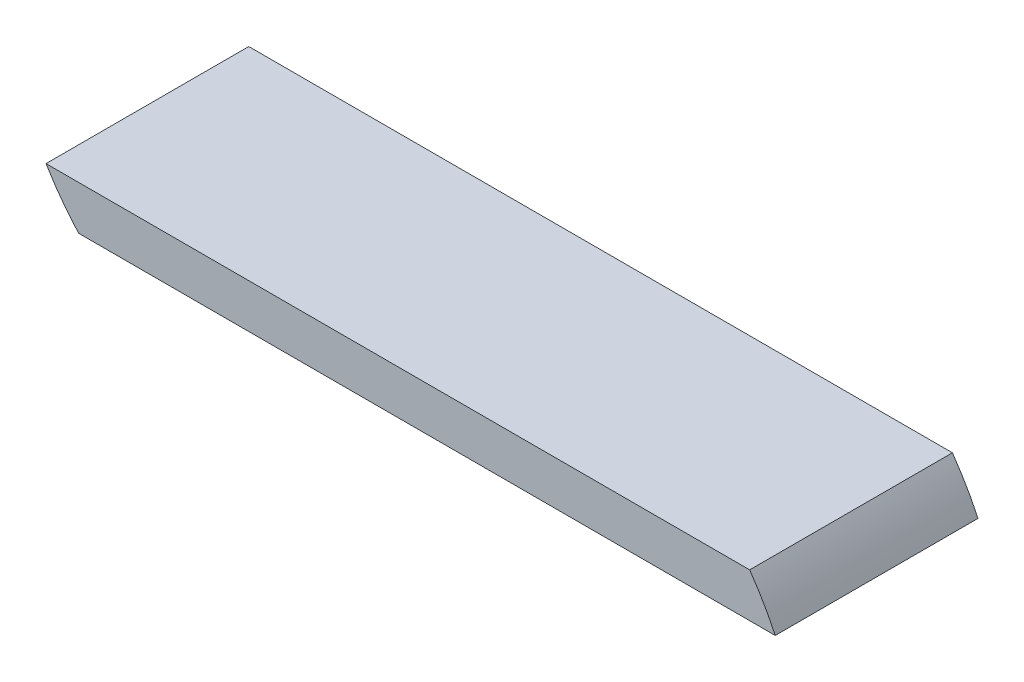
ISO-10303-21;
HEADER;
FILE_DESCRIPTION(('STEP AP214'),'2;1');
FILE_NAME('part.step','',(''),(''),'','','');
FILE_SCHEMA(('AUTOMOTIVE_DESIGN { 1 0 10303 214 1 1 1 1 }'));
ENDSEC;
DATA;
#1=APPLICATION_CONTEXT('core data for automotive mechanical design processes');
#2=APPLICATION_PROTOCOL_DEFINITION('international standard','automotive_design',2000,#1);
#3=PRODUCT_CONTEXT('',#1,'mechanical');
#4=PRODUCT('Part','Part','',(#3));
#5=PRODUCT_RELATED_PRODUCT_CATEGORY('part','',(#4));
#6=PRODUCT_DEFINITION_FORMATION('','',#4);
#7=PRODUCT_DEFINITION_CONTEXT('part definition',#1,'design');
#8=PRODUCT_DEFINITION('design','',#6,#7);
#9=PRODUCT_DEFINITION_SHAPE('','',#8);
#10=(LENGTH_UNIT() NAMED_UNIT(*) SI_UNIT(.MILLI.,.METRE.));
#11=(NAMED_UNIT(*) PLANE_ANGLE_UNIT() SI_UNIT($,.RADIAN.));
#12=(NAMED_UNIT(*) SI_UNIT($,.STERADIAN.) SOLID_ANGLE_UNIT());
#13=UNCERTAINTY_MEASURE_WITH_UNIT(LENGTH_MEASURE(1.E-05),#10,'distance_accuracy_value','');
#14=(GEOMETRIC_REPRESENTATION_CONTEXT(3) GLOBAL_UNCERTAINTY_ASSIGNED_CONTEXT((#13)) GLOBAL_UNIT_ASSIGNED_CONTEXT((#10,
#11,#12)) REPRESENTATION_CONTEXT('',''));
#15=CARTESIAN_POINT('',(0.,0.,0.));
#16=DIRECTION('',(0.,0.,1.));
#17=DIRECTION('',(1.,0.,0.));
#18=AXIS2_PLACEMENT_3D('',#15,#16,#17);
#19=CARTESIAN_POINT('',(-27.087440379805,6.071476226117,0.));
#20=DIRECTION('',(0.,-1.,0.));
#21=DIRECTION('',(1.,0.,0.));
#22=AXIS2_PLACEMENT_3D('',#19,#20,#21);
#23=PLANE('',#22);
#24=DIRECTION('',(1.,0.,0.));
#25=VECTOR('',#24,1.);
#26=CARTESIAN_POINT('',(-27.087440379805,6.071476226117,0.));
#27=LINE('',#26,#25);
#28=CARTESIAN_POINT('',(-27.087440379805,6.071476226117,0.));
#29=VERTEX_POINT('',#28);
#30=CARTESIAN_POINT('',(-26.743838043044,6.071476226117,0.));
#31=VERTEX_POINT('',#30);
#32=EDGE_CURVE('E11',#29,#31,#27,.T.);
#33=ORIENTED_EDGE('',*,*,#32,.T.);
#34=DIRECTION('',(0.,0.,1.));
#35=VECTOR('',#34,1.);
#36=CARTESIAN_POINT('',(-26.743838043044,6.071476226117,0.));
#37=LINE('',#36,#35);
#38=CARTESIAN_POINT('',(-26.743838043044,6.071476226117,0.1));
#39=VERTEX_POINT('',#38);
#40=EDGE_CURVE('E24',#31,#39,#37,.T.);
#41=ORIENTED_EDGE('',*,*,#40,.T.);
#42=DIRECTION('',(1.,0.,0.));
#43=VECTOR('',#42,1.);
#44=CARTESIAN_POINT('',(-27.087440379805,6.071476226117,0.1));
#45=LINE('',#44,#43);
#46=CARTESIAN_POINT('',(-27.087440379805,6.071476226117,0.1));
#47=VERTEX_POINT('',#46);
#48=EDGE_CURVE('E75',#47,#39,#45,.T.);
#49=ORIENTED_EDGE('',*,*,#48,.F.);
#50=DIRECTION('',(0.,0.,1.));
#51=VECTOR('',#50,1.);
#52=CARTESIAN_POINT('',(-27.087440379805,6.071476226117,0.));
#53=LINE('',#52,#51);
#54=EDGE_CURVE('E86',#29,#47,#53,.T.);
#55=ORIENTED_EDGE('',*,*,#54,.F.);
#56=EDGE_LOOP('',(#33,#41,#49,#55));
#57=FACE_BOUND('',#56,.T.);
#58=ADVANCED_FACE('F17',(#57),#23,.T.);
#59=CARTESIAN_POINT('',(-26.983342085285,6.165251438178,0.));
#60=DIRECTION('',(0.,0.,1.));
#61=DIRECTION('',(-0.857659383589662,-0.514218223851121,0.));
#62=AXIS2_PLACEMENT_3D('',#59,#60,#61);
#63=CYLINDRICAL_SURFACE('',#62,0.140107977356891);
#64=CARTESIAN_POINT('',(-26.983342085285,6.165251438178,0.));
#65=DIRECTION('',(0.,0.,1.));
#66=DIRECTION('',(-0.857659383589662,-0.514218223851121,0.));
#67=AXIS2_PLACEMENT_3D('',#64,#65,#66);
#68=CIRCLE('',#67,0.140107977356891);
#69=CARTESIAN_POINT('',(-27.103507006781,6.093205362914,0.));
#70=VERTEX_POINT('',#69);
#71=EDGE_CURVE('E83',#70,#29,#68,.T.);
#72=ORIENTED_EDGE('',*,*,#71,.T.);
#73=ORIENTED_EDGE('',*,*,#54,.T.);
#74=CARTESIAN_POINT('',(-26.983342085285,6.165251438178,0.1));
#75=DIRECTION('',(0.,0.,1.));
#76=DIRECTION('',(-0.857659383589662,-0.514218223851121,0.));
#77=AXIS2_PLACEMENT_3D('',#74,#75,#76);
#78=CIRCLE('',#77,0.140107977356891);
#79=CARTESIAN_POINT('',(-27.103507006781,6.093205362914,0.1));
#80=VERTEX_POINT('',#79);
#81=EDGE_CURVE('E81',#80,#47,#78,.T.);
#82=ORIENTED_EDGE('',*,*,#81,.F.);
#83=DIRECTION('',(0.,0.,1.));
#84=VECTOR('',#83,1.);
#85=CARTESIAN_POINT('',(-27.103507006781,6.093205362914,0.));
#86=LINE('',#85,#84);
#87=EDGE_CURVE('E61',#70,#80,#86,.T.);
#88=ORIENTED_EDGE('',*,*,#87,.F.);
#89=EDGE_LOOP('',(#72,#73,#82,#88));
#90=FACE_BOUND('',#89,.T.);
#91=ADVANCED_FACE('F91',(#90),#63,.T.);
#92=CARTESIAN_POINT('',(-26.756454263164,6.093205362914,0.));
#93=DIRECTION('',(0.,1.,0.));
#94=DIRECTION('',(-1.,0.,0.));
#95=AXIS2_PLACEMENT_3D('',#92,#93,#94);
#96=PLANE('',#95);
#97=DIRECTION('',(-1.,0.,0.));
#98=VECTOR('',#97,1.);
#99=CARTESIAN_POINT('',(-26.756454263164,6.093205362914,0.));
#100=LINE('',#99,#98);
#101=CARTESIAN_POINT('',(-26.756454263164,6.093205362914,0.));
#102=VERTEX_POINT('',#101);
#103=EDGE_CURVE('E65',#102,#70,#100,.T.);
#104=ORIENTED_EDGE('',*,*,#103,.T.);
#105=ORIENTED_EDGE('',*,*,#87,.T.);
#106=DIRECTION('',(-1.,0.,0.));
#107=VECTOR('',#106,1.);
#108=CARTESIAN_POINT('',(-26.756454263164,6.093205362914,0.1));
#109=LINE('',#108,#107);
#110=CARTESIAN_POINT('',(-26.756454263164,6.093205362914,0.1));
#111=VERTEX_POINT('',#110);
#112=EDGE_CURVE('E54',#111,#80,#109,.T.);
#113=ORIENTED_EDGE('',*,*,#112,.F.);
#114=DIRECTION('',(0.,0.,1.));
#115=VECTOR('',#114,1.);
#116=CARTESIAN_POINT('',(-26.756454263164,6.093205362914,0.));
#117=LINE('',#116,#115);
#118=EDGE_CURVE('E58',#102,#111,#117,.T.);
#119=ORIENTED_EDGE('',*,*,#118,.F.);
#120=EDGE_LOOP('',(#104,#105,#113,#119));
#121=FACE_BOUND('',#120,.T.);
#122=ADVANCED_FACE('F57',(#121),#96,.T.);
#123=CARTESIAN_POINT('',(-26.871812170946,6.011699918327,0.));
#124=DIRECTION('',(0.,0.,1.));
#125=DIRECTION('',(0.906033734151552,0.42320547323894,0.));
#126=AXIS2_PLACEMENT_3D('',#123,#124,#125);
#127=CYLINDRICAL_SURFACE('',#126,0.141246537604029);
#128=CARTESIAN_POINT('',(-26.871812170946,6.011699918327,0.));
#129=DIRECTION('',(0.,0.,1.));
#130=DIRECTION('',(0.906033734151552,0.42320547323894,0.));
#131=AXIS2_PLACEMENT_3D('',#128,#129,#130);
#132=CIRCLE('',#131,0.141246537604029);
#133=EDGE_CURVE('E71',#31,#102,#132,.T.);
#134=ORIENTED_EDGE('',*,*,#133,.T.);
#135=ORIENTED_EDGE('',*,*,#118,.T.);
#136=CARTESIAN_POINT('',(-26.871812170946,6.011699918327,0.1));
#137=DIRECTION('',(0.,0.,1.));
#138=DIRECTION('',(0.906033734151552,0.42320547323894,0.));
#139=AXIS2_PLACEMENT_3D('',#136,#137,#138);
#140=CIRCLE('',#139,0.141246537604029);
#141=EDGE_CURVE('E70',#39,#111,#140,.T.);
#142=ORIENTED_EDGE('',*,*,#141,.F.);
#143=ORIENTED_EDGE('',*,*,#40,.F.);
#144=EDGE_LOOP('',(#134,#135,#142,#143));
#145=FACE_BOUND('',#144,.T.);
#146=ADVANCED_FACE('F69',(#145),#127,.T.);
#147=CARTESIAN_POINT('',(-26.923183510891,6.082389805148,0.1));
#148=DIRECTION('',(0.,0.,1.));
#149=DIRECTION('',(1.,0.,0.));
#150=AXIS2_PLACEMENT_3D('',#147,#148,#149);
#151=PLANE('',#150);
#152=ORIENTED_EDGE('',*,*,#141,.T.);
#153=ORIENTED_EDGE('',*,*,#112,.T.);
#154=ORIENTED_EDGE('',*,*,#81,.T.);
#155=ORIENTED_EDGE('',*,*,#48,.T.);
#156=EDGE_LOOP('',(#152,#153,#154,#155));
#157=FACE_BOUND('',#156,.T.);
#158=ADVANCED_FACE('F74',(#157),#151,.T.);
#159=CARTESIAN_POINT('',(-26.923183510891,6.082389805148,0.));
#160=DIRECTION('',(0.,0.,1.));
#161=DIRECTION('',(1.,0.,0.));
#162=AXIS2_PLACEMENT_3D('',#159,#160,#161);
#163=PLANE('',#162);
#164=ORIENTED_EDGE('',*,*,#133,.F.);
#165=ORIENTED_EDGE('',*,*,#32,.F.);
#166=ORIENTED_EDGE('',*,*,#71,.F.);
#167=ORIENTED_EDGE('',*,*,#103,.F.);
#168=EDGE_LOOP('',(#164,#165,#166,#167));
#169=FACE_BOUND('',#168,.T.);
#170=ADVANCED_FACE('F89',(#169),#163,.F.);
#171=CLOSED_SHELL('',(#58,#91,#122,#146,#158,#170));
#172=MANIFOLD_SOLID_BREP('B1',#171);
#173=ADVANCED_BREP_SHAPE_REPRESENTATION('',(#18,#172),#14);
#174=SHAPE_DEFINITION_REPRESENTATION(#9,#173);
ENDSEC;
END-ISO-10303-21;
